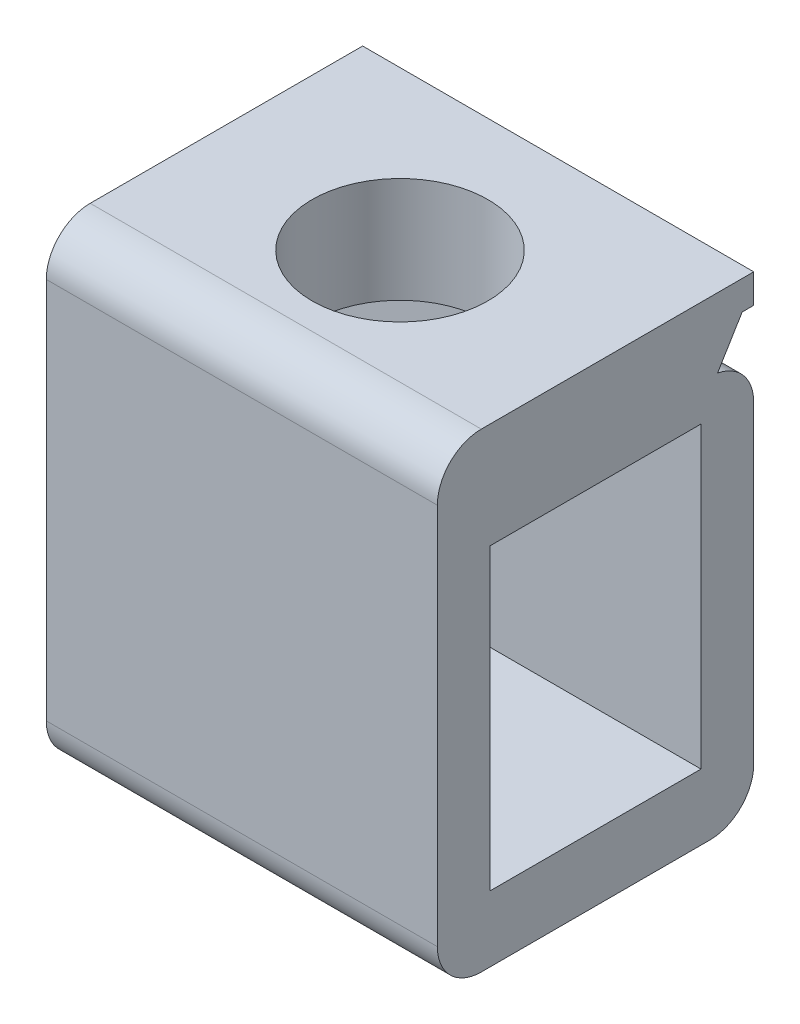
ISO-10303-21;
HEADER;
FILE_DESCRIPTION(('STEP AP214'),'2;1');
FILE_NAME('part.step','',(''),(''),'','','');
FILE_SCHEMA(('AUTOMOTIVE_DESIGN { 1 0 10303 214 1 1 1 1 }'));
ENDSEC;
DATA;
#1=APPLICATION_CONTEXT('core data for automotive mechanical design processes');
#2=APPLICATION_PROTOCOL_DEFINITION('international standard','automotive_design',2000,#1);
#3=PRODUCT_CONTEXT('',#1,'mechanical');
#4=PRODUCT('Part','Part','',(#3));
#5=PRODUCT_RELATED_PRODUCT_CATEGORY('part','',(#4));
#6=PRODUCT_DEFINITION_FORMATION('','',#4);
#7=PRODUCT_DEFINITION_CONTEXT('part definition',#1,'design');
#8=PRODUCT_DEFINITION('design','',#6,#7);
#9=PRODUCT_DEFINITION_SHAPE('','',#8);
#10=(LENGTH_UNIT() NAMED_UNIT(*) SI_UNIT(.MILLI.,.METRE.));
#11=(NAMED_UNIT(*) PLANE_ANGLE_UNIT() SI_UNIT($,.RADIAN.));
#12=(NAMED_UNIT(*) SI_UNIT($,.STERADIAN.) SOLID_ANGLE_UNIT());
#13=UNCERTAINTY_MEASURE_WITH_UNIT(LENGTH_MEASURE(1.E-05),#10,'distance_accuracy_value','');
#14=(GEOMETRIC_REPRESENTATION_CONTEXT(3) GLOBAL_UNCERTAINTY_ASSIGNED_CONTEXT((#13)) GLOBAL_UNIT_ASSIGNED_CONTEXT((#10,
#11,#12)) REPRESENTATION_CONTEXT('',''));
#15=CARTESIAN_POINT('',(0.,0.,0.));
#16=DIRECTION('',(0.,0.,1.));
#17=DIRECTION('',(1.,0.,0.));
#18=AXIS2_PLACEMENT_3D('',#15,#16,#17);
#19=CARTESIAN_POINT('',(-4.45,5.35,-3.6));
#20=DIRECTION('',(0.,0.,-1.));
#21=DIRECTION('',(0.,1.,0.));
#22=AXIS2_PLACEMENT_3D('',#19,#20,#21);
#23=PLANE('',#22);
#24=DIRECTION('',(0.,1.,0.));
#25=VECTOR('',#24,1.);
#26=CARTESIAN_POINT('',(-4.45,5.35,-3.6));
#27=LINE('',#26,#25);
#28=CARTESIAN_POINT('',(-4.45,-4.34999999999999,-3.60000000000001));
#29=VERTEX_POINT('',#28);
#30=CARTESIAN_POINT('',(-4.45,2.78084650987557,-3.6));
#31=VERTEX_POINT('',#30);
#32=EDGE_CURVE('E231',#29,#31,#27,.T.);
#33=ORIENTED_EDGE('',*,*,#32,.T.);
#34=DIRECTION('',(1.,0.,0.));
#35=VECTOR('',#34,1.);
#36=CARTESIAN_POINT('',(4.45,2.78084650987557,-3.6));
#37=LINE('',#36,#35);
#38=CARTESIAN_POINT('',(4.45,2.78084650987557,-3.6));
#39=VERTEX_POINT('',#38);
#40=EDGE_CURVE('E243',#31,#39,#37,.T.);
#41=ORIENTED_EDGE('',*,*,#40,.T.);
#42=DIRECTION('',(0.,1.,0.));
#43=VECTOR('',#42,1.);
#44=CARTESIAN_POINT('',(4.45,5.35,-3.6));
#45=LINE('',#44,#43);
#46=CARTESIAN_POINT('',(4.45,-4.34999999999999,-3.60000000000001));
#47=VERTEX_POINT('',#46);
#48=EDGE_CURVE('E200',#47,#39,#45,.T.);
#49=ORIENTED_EDGE('',*,*,#48,.F.);
#50=DIRECTION('',(1.,0.,0.));
#51=VECTOR('',#50,1.);
#52=CARTESIAN_POINT('',(-4.45,-4.34999999999999,-3.60000000000001));
#53=LINE('',#52,#51);
#54=EDGE_CURVE('E239',#47,#29,#53,.F.);
#55=ORIENTED_EDGE('',*,*,#54,.T.);
#56=EDGE_LOOP('',(#33,#41,#49,#55));
#57=FACE_BOUND('',#56,.T.);
#58=ADVANCED_FACE('F37',(#57),#23,.T.);
#59=CARTESIAN_POINT('',(-4.45,5.35,3.6));
#60=DIRECTION('',(0.,0.,1.));
#61=DIRECTION('',(0.,-1.,0.));
#62=AXIS2_PLACEMENT_3D('',#59,#60,#61);
#63=PLANE('',#62);
#64=DIRECTION('',(0.,-1.,0.));
#65=VECTOR('',#64,1.);
#66=CARTESIAN_POINT('',(-4.45,5.35,3.6));
#67=LINE('',#66,#65);
#68=CARTESIAN_POINT('',(-4.45,4.35,3.6));
#69=VERTEX_POINT('',#68);
#70=CARTESIAN_POINT('',(-4.45,-4.35,3.6));
#71=VERTEX_POINT('',#70);
#72=EDGE_CURVE('E220',#69,#71,#67,.T.);
#73=ORIENTED_EDGE('',*,*,#72,.T.);
#74=DIRECTION('',(1.,0.,0.));
#75=VECTOR('',#74,1.);
#76=CARTESIAN_POINT('',(-4.45,-4.35,3.6));
#77=LINE('',#76,#75);
#78=CARTESIAN_POINT('',(4.45,-4.35,3.6));
#79=VERTEX_POINT('',#78);
#80=EDGE_CURVE('E45',#71,#79,#77,.T.);
#81=ORIENTED_EDGE('',*,*,#80,.T.);
#82=DIRECTION('',(0.,-1.,0.));
#83=VECTOR('',#82,1.);
#84=CARTESIAN_POINT('',(4.45,5.35,3.6));
#85=LINE('',#84,#83);
#86=CARTESIAN_POINT('',(4.45,4.35,3.6));
#87=VERTEX_POINT('',#86);
#88=EDGE_CURVE('E193',#87,#79,#85,.T.);
#89=ORIENTED_EDGE('',*,*,#88,.F.);
#90=DIRECTION('',(1.,0.,0.));
#91=VECTOR('',#90,1.);
#92=CARTESIAN_POINT('',(-4.45,4.35,3.6));
#93=LINE('',#92,#91);
#94=EDGE_CURVE('E264',#87,#69,#93,.F.);
#95=ORIENTED_EDGE('',*,*,#94,.T.);
#96=EDGE_LOOP('',(#73,#81,#89,#95));
#97=FACE_BOUND('',#96,.T.);
#98=ADVANCED_FACE('F269',(#97),#63,.T.);
#99=CARTESIAN_POINT('',(-4.45,5.35,3.6));
#100=DIRECTION('',(0.,1.,0.));
#101=DIRECTION('',(0.,0.,1.));
#102=AXIS2_PLACEMENT_3D('',#99,#100,#101);
#103=PLANE('',#102);
#104=CARTESIAN_POINT('',(0.,5.35,0.));
#105=DIRECTION('',(0.,1.,0.));
#106=DIRECTION('',(0.,0.,1.));
#107=AXIS2_PLACEMENT_3D('',#104,#105,#106);
#108=CIRCLE('',#107,2.);
#109=CARTESIAN_POINT('',(0.,5.35,2.));
#110=VERTEX_POINT('',#109);
#111=EDGE_CURVE('E177',#110,#110,#108,.T.);
#112=ORIENTED_EDGE('',*,*,#111,.F.);
#113=EDGE_LOOP('',(#112));
#114=FACE_BOUND('',#113,.T.);
#115=DIRECTION('',(0.,0.,1.));
#116=VECTOR('',#115,1.);
#117=CARTESIAN_POINT('',(-4.45,5.35,3.6));
#118=LINE('',#117,#116);
#119=CARTESIAN_POINT('',(-4.45,5.35,-3.6));
#120=VERTEX_POINT('',#119);
#121=CARTESIAN_POINT('',(-4.45,5.35,2.6));
#122=VERTEX_POINT('',#121);
#123=EDGE_CURVE('E234',#120,#122,#118,.T.);
#124=ORIENTED_EDGE('',*,*,#123,.T.);
#125=DIRECTION('',(1.,0.,0.));
#126=VECTOR('',#125,1.);
#127=CARTESIAN_POINT('',(-4.45,5.35,2.6));
#128=LINE('',#127,#126);
#129=CARTESIAN_POINT('',(4.45,5.35,2.6));
#130=VERTEX_POINT('',#129);
#131=EDGE_CURVE('E11',#122,#130,#128,.T.);
#132=ORIENTED_EDGE('',*,*,#131,.T.);
#133=DIRECTION('',(0.,0.,1.));
#134=VECTOR('',#133,1.);
#135=CARTESIAN_POINT('',(4.45,5.35,3.6));
#136=LINE('',#135,#134);
#137=CARTESIAN_POINT('',(4.45,5.35,-3.6));
#138=VERTEX_POINT('',#137);
#139=EDGE_CURVE('E202',#138,#130,#136,.T.);
#140=ORIENTED_EDGE('',*,*,#139,.F.);
#141=DIRECTION('',(1.,0.,0.));
#142=VECTOR('',#141,1.);
#143=CARTESIAN_POINT('',(-4.45,5.35,-3.6));
#144=LINE('',#143,#142);
#145=EDGE_CURVE('E236',#120,#138,#144,.T.);
#146=ORIENTED_EDGE('',*,*,#145,.F.);
#147=EDGE_LOOP('',(#124,#132,#140,#146));
#148=FACE_BOUND('',#147,.T.);
#149=ADVANCED_FACE('F277',(#114,#148),#103,.T.);
#150=DIRECTION('',(1.,0.,0.));
#151=VECTOR('',#150,1.);
#152=CARTESIAN_POINT('',(-5.68756058204341,4.68856681788835,-3.6));
#153=LINE('',#152,#151);
#154=CARTESIAN_POINT('',(-4.45,4.68856681788835,-3.6));
#155=VERTEX_POINT('',#154);
#156=CARTESIAN_POINT('',(4.45,4.68856681788835,-3.6));
#157=VERTEX_POINT('',#156);
#158=EDGE_CURVE('E157',#155,#157,#153,.T.);
#159=ORIENTED_EDGE('',*,*,#158,.F.);
#160=EDGE_CURVE('E230',#155,#120,#27,.T.);
#161=ORIENTED_EDGE('',*,*,#160,.T.);
#162=ORIENTED_EDGE('',*,*,#145,.T.);
#163=EDGE_CURVE('E199',#157,#138,#45,.T.);
#164=ORIENTED_EDGE('',*,*,#163,.F.);
#165=EDGE_LOOP('',(#159,#161,#162,#164));
#166=FACE_BOUND('',#165,.T.);
#167=ADVANCED_FACE('F282',(#166),#23,.T.);
#168=CARTESIAN_POINT('',(-4.45,-5.35,3.6));
#169=DIRECTION('',(0.,-1.,0.));
#170=DIRECTION('',(0.,0.,-1.));
#171=AXIS2_PLACEMENT_3D('',#168,#169,#170);
#172=PLANE('',#171);
#173=DIRECTION('',(0.,0.,-1.));
#174=VECTOR('',#173,1.);
#175=CARTESIAN_POINT('',(-4.45,-5.35,3.6));
#176=LINE('',#175,#174);
#177=CARTESIAN_POINT('',(-4.45,-5.35,2.6));
#178=VERTEX_POINT('',#177);
#179=CARTESIAN_POINT('',(-4.45,-5.35,-2.60000000000001));
#180=VERTEX_POINT('',#179);
#181=EDGE_CURVE('E227',#178,#180,#176,.T.);
#182=ORIENTED_EDGE('',*,*,#181,.T.);
#183=DIRECTION('',(1.,0.,0.));
#184=VECTOR('',#183,1.);
#185=CARTESIAN_POINT('',(-4.45,-5.35,-2.60000000000001));
#186=LINE('',#185,#184);
#187=CARTESIAN_POINT('',(4.45,-5.35,-2.60000000000001));
#188=VERTEX_POINT('',#187);
#189=EDGE_CURVE('E261',#180,#188,#186,.T.);
#190=ORIENTED_EDGE('',*,*,#189,.T.);
#191=DIRECTION('',(0.,0.,-1.));
#192=VECTOR('',#191,1.);
#193=CARTESIAN_POINT('',(4.45,-5.35,3.6));
#194=LINE('',#193,#192);
#195=CARTESIAN_POINT('',(4.45,-5.35,2.6));
#196=VERTEX_POINT('',#195);
#197=EDGE_CURVE('E196',#196,#188,#194,.T.);
#198=ORIENTED_EDGE('',*,*,#197,.F.);
#199=DIRECTION('',(1.,0.,0.));
#200=VECTOR('',#199,1.);
#201=CARTESIAN_POINT('',(-4.45,-5.35,2.6));
#202=LINE('',#201,#200);
#203=EDGE_CURVE('E259',#196,#178,#202,.F.);
#204=ORIENTED_EDGE('',*,*,#203,.T.);
#205=EDGE_LOOP('',(#182,#190,#198,#204));
#206=FACE_BOUND('',#205,.T.);
#207=ADVANCED_FACE('F284',(#206),#172,.T.);
#208=CARTESIAN_POINT('',(-4.45,0.,0.));
#209=DIRECTION('',(1.,0.,0.));
#210=DIRECTION('',(0.,0.,-1.));
#211=AXIS2_PLACEMENT_3D('',#208,#209,#210);
#212=PLANE('',#211);
#213=DIRECTION('',(0.,0.,-1.));
#214=VECTOR('',#213,1.);
#215=CARTESIAN_POINT('',(-4.45,-3.85,-2.40000000000002));
#216=LINE('',#215,#214);
#217=CARTESIAN_POINT('',(-4.45,-3.85,2.4));
#218=VERTEX_POINT('',#217);
#219=CARTESIAN_POINT('',(-4.45,-3.85,-2.40000000000002));
#220=VERTEX_POINT('',#219);
#221=EDGE_CURVE('E214',#218,#220,#216,.T.);
#222=ORIENTED_EDGE('',*,*,#221,.T.);
#223=DIRECTION('',(0.,1.,0.));
#224=VECTOR('',#223,1.);
#225=CARTESIAN_POINT('',(-4.45,-3.85,-2.40000000000002));
#226=LINE('',#225,#224);
#227=CARTESIAN_POINT('',(-4.45,2.95,-2.40000000000002));
#228=VERTEX_POINT('',#227);
#229=EDGE_CURVE('E205',#220,#228,#226,.T.);
#230=ORIENTED_EDGE('',*,*,#229,.T.);
#231=DIRECTION('',(0.,0.,1.));
#232=VECTOR('',#231,1.);
#233=CARTESIAN_POINT('',(-4.45,2.95,-2.40000000000002));
#234=LINE('',#233,#232);
#235=CARTESIAN_POINT('',(-4.45,2.95,2.4));
#236=VERTEX_POINT('',#235);
#237=EDGE_CURVE('E208',#228,#236,#234,.T.);
#238=ORIENTED_EDGE('',*,*,#237,.T.);
#239=DIRECTION('',(0.,-1.,0.));
#240=VECTOR('',#239,1.);
#241=CARTESIAN_POINT('',(-4.45,-3.85,2.4));
#242=LINE('',#241,#240);
#243=EDGE_CURVE('E211',#236,#218,#242,.T.);
#244=ORIENTED_EDGE('',*,*,#243,.T.);
#245=EDGE_LOOP('',(#222,#230,#238,#244));
#246=FACE_BOUND('',#245,.T.);
#247=DIRECTION('',(0.,0.854660940645828,-0.519186552728775));
#248=VECTOR('',#247,1.);
#249=CARTESIAN_POINT('',(-4.45,4.68856681788835,-3.33686645723071));
#250=LINE('',#249,#248);
#251=CARTESIAN_POINT('',(-4.45,3.76524232549678,-2.77596840110499));
#252=VERTEX_POINT('',#251);
#253=CARTESIAN_POINT('',(-4.45,4.68856681788835,-3.33686645723071));
#254=VERTEX_POINT('',#253);
#255=EDGE_CURVE('E153',#252,#254,#250,.T.);
#256=ORIENTED_EDGE('',*,*,#255,.F.);
#257=CARTESIAN_POINT('',(-4.45,2.78084650987556,-2.6));
#258=DIRECTION('',(1.,0.,0.));
#259=DIRECTION('',(0.,0.,-1.));
#260=AXIS2_PLACEMENT_3D('',#257,#258,#259);
#261=CIRCLE('',#260,1.);
#262=EDGE_CURVE('E257',#252,#31,#261,.F.);
#263=ORIENTED_EDGE('',*,*,#262,.T.);
#264=ORIENTED_EDGE('',*,*,#32,.F.);
#265=CARTESIAN_POINT('',(-4.45,-4.35,-2.60000000000001));
#266=DIRECTION('',(1.,0.,0.));
#267=DIRECTION('',(0.,0.,-1.));
#268=AXIS2_PLACEMENT_3D('',#265,#266,#267);
#269=CIRCLE('',#268,1.);
#270=EDGE_CURVE('E255',#29,#180,#269,.F.);
#271=ORIENTED_EDGE('',*,*,#270,.T.);
#272=ORIENTED_EDGE('',*,*,#181,.F.);
#273=CARTESIAN_POINT('',(-4.45,-4.35,2.6));
#274=DIRECTION('',(1.,0.,0.));
#275=DIRECTION('',(0.,0.,-1.));
#276=AXIS2_PLACEMENT_3D('',#273,#274,#275);
#277=CIRCLE('',#276,1.);
#278=EDGE_CURVE('E58',#178,#71,#277,.F.);
#279=ORIENTED_EDGE('',*,*,#278,.T.);
#280=ORIENTED_EDGE('',*,*,#72,.F.);
#281=CARTESIAN_POINT('',(-4.45,4.35,2.6));
#282=DIRECTION('',(1.,0.,0.));
#283=DIRECTION('',(0.,0.,-1.));
#284=AXIS2_PLACEMENT_3D('',#281,#282,#283);
#285=CIRCLE('',#284,1.);
#286=EDGE_CURVE('E52',#69,#122,#285,.F.);
#287=ORIENTED_EDGE('',*,*,#286,.T.);
#288=ORIENTED_EDGE('',*,*,#123,.F.);
#289=ORIENTED_EDGE('',*,*,#160,.F.);
#290=DIRECTION('',(0.,0.,-1.));
#291=VECTOR('',#290,1.);
#292=CARTESIAN_POINT('',(-4.45,4.68856681788835,-3.6));
#293=LINE('',#292,#291);
#294=EDGE_CURVE('E175',#254,#155,#293,.T.);
#295=ORIENTED_EDGE('',*,*,#294,.F.);
#296=EDGE_LOOP('',(#256,#263,#264,#271,#272,#279,#280,#287,#288,#289,#295));
#297=FACE_BOUND('',#296,.T.);
#298=ADVANCED_FACE('F280',(#246,#297),#212,.F.);
#299=CARTESIAN_POINT('',(-4.45,-3.85,-2.40000000000002));
#300=DIRECTION('',(0.,0.,-1.));
#301=DIRECTION('',(0.,1.,0.));
#302=AXIS2_PLACEMENT_3D('',#299,#300,#301);
#303=PLANE('',#302);
#304=DIRECTION('',(1.,0.,0.));
#305=VECTOR('',#304,1.);
#306=CARTESIAN_POINT('',(-4.45,-3.85,-2.40000000000002));
#307=LINE('',#306,#305);
#308=CARTESIAN_POINT('',(4.45,-3.85,-2.40000000000002));
#309=VERTEX_POINT('',#308);
#310=EDGE_CURVE('E218',#220,#309,#307,.T.);
#311=ORIENTED_EDGE('',*,*,#310,.T.);
#312=DIRECTION('',(0.,1.,0.));
#313=VECTOR('',#312,1.);
#314=CARTESIAN_POINT('',(4.45,-3.85,-2.40000000000002));
#315=LINE('',#314,#313);
#316=CARTESIAN_POINT('',(4.45,2.95,-2.40000000000002));
#317=VERTEX_POINT('',#316);
#318=EDGE_CURVE('E181',#309,#317,#315,.T.);
#319=ORIENTED_EDGE('',*,*,#318,.T.);
#320=DIRECTION('',(1.,0.,0.));
#321=VECTOR('',#320,1.);
#322=CARTESIAN_POINT('',(-4.45,2.95,-2.40000000000002));
#323=LINE('',#322,#321);
#324=EDGE_CURVE('E217',#228,#317,#323,.T.);
#325=ORIENTED_EDGE('',*,*,#324,.F.);
#326=ORIENTED_EDGE('',*,*,#229,.F.);
#327=EDGE_LOOP('',(#311,#319,#325,#326));
#328=FACE_BOUND('',#327,.T.);
#329=ADVANCED_FACE('F374',(#328),#303,.F.);
#330=CARTESIAN_POINT('',(-4.45,-3.85,-2.40000000000002));
#331=DIRECTION('',(0.,-1.,0.));
#332=DIRECTION('',(0.,0.,-1.));
#333=AXIS2_PLACEMENT_3D('',#330,#331,#332);
#334=PLANE('',#333);
#335=DIRECTION('',(1.,0.,0.));
#336=VECTOR('',#335,1.);
#337=CARTESIAN_POINT('',(-4.45,-3.85,2.4));
#338=LINE('',#337,#336);
#339=CARTESIAN_POINT('',(4.45,-3.85,2.4));
#340=VERTEX_POINT('',#339);
#341=EDGE_CURVE('E221',#218,#340,#338,.T.);
#342=ORIENTED_EDGE('',*,*,#341,.T.);
#343=DIRECTION('',(0.,0.,-1.));
#344=VECTOR('',#343,1.);
#345=CARTESIAN_POINT('',(4.45,-3.85,-2.40000000000002));
#346=LINE('',#345,#344);
#347=EDGE_CURVE('E190',#340,#309,#346,.T.);
#348=ORIENTED_EDGE('',*,*,#347,.T.);
#349=ORIENTED_EDGE('',*,*,#310,.F.);
#350=ORIENTED_EDGE('',*,*,#221,.F.);
#351=EDGE_LOOP('',(#342,#348,#349,#350));
#352=FACE_BOUND('',#351,.T.);
#353=ADVANCED_FACE('F431',(#352),#334,.F.);
#354=CARTESIAN_POINT('',(-4.45,-3.85,2.4));
#355=DIRECTION('',(0.,0.,1.));
#356=DIRECTION('',(1.,0.,0.));
#357=AXIS2_PLACEMENT_3D('',#354,#355,#356);
#358=PLANE('',#357);
#359=DIRECTION('',(1.,0.,0.));
#360=VECTOR('',#359,1.);
#361=CARTESIAN_POINT('',(-4.45,2.95,2.4));
#362=LINE('',#361,#360);
#363=CARTESIAN_POINT('',(4.45,2.95,2.4));
#364=VERTEX_POINT('',#363);
#365=EDGE_CURVE('E223',#236,#364,#362,.T.);
#366=ORIENTED_EDGE('',*,*,#365,.T.);
#367=DIRECTION('',(0.,-1.,0.));
#368=VECTOR('',#367,1.);
#369=CARTESIAN_POINT('',(4.45,-3.85,2.4));
#370=LINE('',#369,#368);
#371=EDGE_CURVE('E187',#364,#340,#370,.T.);
#372=ORIENTED_EDGE('',*,*,#371,.T.);
#373=ORIENTED_EDGE('',*,*,#341,.F.);
#374=ORIENTED_EDGE('',*,*,#243,.F.);
#375=EDGE_LOOP('',(#366,#372,#373,#374));
#376=FACE_BOUND('',#375,.T.);
#377=ADVANCED_FACE('F421',(#376),#358,.F.);
#378=CARTESIAN_POINT('',(-4.45,2.95,-2.40000000000002));
#379=DIRECTION('',(0.,1.,0.));
#380=DIRECTION('',(0.,0.,1.));
#381=AXIS2_PLACEMENT_3D('',#378,#379,#380);
#382=PLANE('',#381);
#383=CARTESIAN_POINT('',(0.,2.95,0.));
#384=DIRECTION('',(0.,1.,0.));
#385=DIRECTION('',(0.,0.,1.));
#386=AXIS2_PLACEMENT_3D('',#383,#384,#385);
#387=CIRCLE('',#386,2.);
#388=CARTESIAN_POINT('',(0.,2.95,2.));
#389=VERTEX_POINT('',#388);
#390=EDGE_CURVE('E180',#389,#389,#387,.T.);
#391=ORIENTED_EDGE('',*,*,#390,.T.);
#392=EDGE_LOOP('',(#391));
#393=FACE_BOUND('',#392,.T.);
#394=ORIENTED_EDGE('',*,*,#324,.T.);
#395=DIRECTION('',(0.,0.,1.));
#396=VECTOR('',#395,1.);
#397=CARTESIAN_POINT('',(4.45,2.95,-2.40000000000002));
#398=LINE('',#397,#396);
#399=EDGE_CURVE('E184',#317,#364,#398,.T.);
#400=ORIENTED_EDGE('',*,*,#399,.T.);
#401=ORIENTED_EDGE('',*,*,#365,.F.);
#402=ORIENTED_EDGE('',*,*,#237,.F.);
#403=EDGE_LOOP('',(#394,#400,#401,#402));
#404=FACE_BOUND('',#403,.T.);
#405=ADVANCED_FACE('F362',(#393,#404),#382,.F.);
#406=CARTESIAN_POINT('',(4.45,0.,0.));
#407=DIRECTION('',(1.,0.,0.));
#408=DIRECTION('',(0.,0.,-1.));
#409=AXIS2_PLACEMENT_3D('',#406,#407,#408);
#410=PLANE('',#409);
#411=ORIENTED_EDGE('',*,*,#48,.T.);
#412=CARTESIAN_POINT('',(4.45,2.78084650987556,-2.6));
#413=DIRECTION('',(1.,0.,0.));
#414=DIRECTION('',(0.,0.,-1.));
#415=AXIS2_PLACEMENT_3D('',#412,#413,#414);
#416=CIRCLE('',#415,1.);
#417=CARTESIAN_POINT('',(4.45,3.76524232549678,-2.77596840110499));
#418=VERTEX_POINT('',#417);
#419=EDGE_CURVE('E169',#39,#418,#416,.T.);
#420=ORIENTED_EDGE('',*,*,#419,.T.);
#421=DIRECTION('',(0.,-0.854660940645828,0.519186552728775));
#422=VECTOR('',#421,1.);
#423=CARTESIAN_POINT('',(4.45,4.68856681788835,-3.33686645723071));
#424=LINE('',#423,#422);
#425=CARTESIAN_POINT('',(4.45,4.68856681788835,-3.33686645723071));
#426=VERTEX_POINT('',#425);
#427=EDGE_CURVE('E150',#426,#418,#424,.T.);
#428=ORIENTED_EDGE('',*,*,#427,.F.);
#429=DIRECTION('',(0.,0.,1.));
#430=VECTOR('',#429,1.);
#431=CARTESIAN_POINT('',(4.45,4.68856681788835,-3.6));
#432=LINE('',#431,#430);
#433=EDGE_CURVE('E160',#157,#426,#432,.T.);
#434=ORIENTED_EDGE('',*,*,#433,.F.);
#435=ORIENTED_EDGE('',*,*,#163,.T.);
#436=ORIENTED_EDGE('',*,*,#139,.T.);
#437=CARTESIAN_POINT('',(4.45,4.35,2.6));
#438=DIRECTION('',(1.,0.,0.));
#439=DIRECTION('',(0.,0.,-1.));
#440=AXIS2_PLACEMENT_3D('',#437,#438,#439);
#441=CIRCLE('',#440,1.);
#442=EDGE_CURVE('E246',#130,#87,#441,.T.);
#443=ORIENTED_EDGE('',*,*,#442,.T.);
#444=ORIENTED_EDGE('',*,*,#88,.T.);
#445=CARTESIAN_POINT('',(4.45,-4.35,2.6));
#446=DIRECTION('',(1.,0.,0.));
#447=DIRECTION('',(0.,0.,-1.));
#448=AXIS2_PLACEMENT_3D('',#445,#446,#447);
#449=CIRCLE('',#448,1.);
#450=EDGE_CURVE('E248',#79,#196,#449,.T.);
#451=ORIENTED_EDGE('',*,*,#450,.T.);
#452=ORIENTED_EDGE('',*,*,#197,.T.);
#453=CARTESIAN_POINT('',(4.45,-4.35,-2.60000000000001));
#454=DIRECTION('',(1.,0.,0.));
#455=DIRECTION('',(0.,0.,-1.));
#456=AXIS2_PLACEMENT_3D('',#453,#454,#455);
#457=CIRCLE('',#456,1.);
#458=EDGE_CURVE('E250',#188,#47,#457,.T.);
#459=ORIENTED_EDGE('',*,*,#458,.T.);
#460=EDGE_LOOP('',(#411,#420,#428,#434,#435,#436,#443,#444,#451,#452,#459));
#461=FACE_BOUND('',#460,.T.);
#462=ORIENTED_EDGE('',*,*,#399,.F.);
#463=ORIENTED_EDGE('',*,*,#318,.F.);
#464=ORIENTED_EDGE('',*,*,#347,.F.);
#465=ORIENTED_EDGE('',*,*,#371,.F.);
#466=EDGE_LOOP('',(#462,#463,#464,#465));
#467=FACE_BOUND('',#466,.T.);
#468=ADVANCED_FACE('F167',(#461,#467),#410,.T.);
#469=CARTESIAN_POINT('',(0.,0.350000000000004,0.));
#470=DIRECTION('',(0.,1.,0.));
#471=DIRECTION('',(0.,0.,1.));
#472=AXIS2_PLACEMENT_3D('',#469,#470,#471);
#473=CYLINDRICAL_SURFACE('',#472,2.);
#474=ORIENTED_EDGE('',*,*,#111,.T.);
#475=EDGE_LOOP('',(#474));
#476=FACE_BOUND('',#475,.T.);
#477=ORIENTED_EDGE('',*,*,#390,.F.);
#478=EDGE_LOOP('',(#477));
#479=FACE_BOUND('',#478,.T.);
#480=ADVANCED_FACE('F351',(#476,#479),#473,.F.);
#481=CARTESIAN_POINT('',(-5.68756058204341,4.68856681788835,-3.33686645723071));
#482=DIRECTION('',(0.,0.519186552728775,0.854660940645828));
#483=DIRECTION('',(0.,-0.854660940645828,0.519186552728775));
#484=AXIS2_PLACEMENT_3D('',#481,#482,#483);
#485=PLANE('',#484);
#486=ORIENTED_EDGE('',*,*,#255,.T.);
#487=DIRECTION('',(1.,0.,0.));
#488=VECTOR('',#487,1.);
#489=CARTESIAN_POINT('',(-5.68756058204341,4.68856681788835,-3.33686645723071));
#490=LINE('',#489,#488);
#491=EDGE_CURVE('E146',#254,#426,#490,.T.);
#492=ORIENTED_EDGE('',*,*,#491,.T.);
#493=ORIENTED_EDGE('',*,*,#427,.T.);
#494=DIRECTION('',(1.,0.,0.));
#495=VECTOR('',#494,1.);
#496=CARTESIAN_POINT('',(-5.68756058204341,3.76524232549678,-2.77596840110499));
#497=LINE('',#496,#495);
#498=EDGE_CURVE('E156',#252,#418,#497,.T.);
#499=ORIENTED_EDGE('',*,*,#498,.F.);
#500=EDGE_LOOP('',(#486,#492,#493,#499));
#501=FACE_BOUND('',#500,.T.);
#502=ADVANCED_FACE('F148',(#501),#485,.F.);
#503=CARTESIAN_POINT('',(-5.68756058204341,4.68856681788835,-3.6));
#504=DIRECTION('',(0.,1.,0.));
#505=DIRECTION('',(0.,0.,1.));
#506=AXIS2_PLACEMENT_3D('',#503,#504,#505);
#507=PLANE('',#506);
#508=ORIENTED_EDGE('',*,*,#294,.T.);
#509=ORIENTED_EDGE('',*,*,#158,.T.);
#510=ORIENTED_EDGE('',*,*,#433,.T.);
#511=ORIENTED_EDGE('',*,*,#491,.F.);
#512=EDGE_LOOP('',(#508,#509,#510,#511));
#513=FACE_BOUND('',#512,.T.);
#514=ADVANCED_FACE('F161',(#513),#507,.F.);
#515=CARTESIAN_POINT('',(-5.68756058204341,2.78084650987556,-2.6));
#516=DIRECTION('',(-1.,0.,0.));
#517=DIRECTION('',(0.,0.,1.));
#518=AXIS2_PLACEMENT_3D('',#515,#516,#517);
#519=CYLINDRICAL_SURFACE('',#518,1.);
#520=ORIENTED_EDGE('',*,*,#262,.F.);
#521=ORIENTED_EDGE('',*,*,#498,.T.);
#522=ORIENTED_EDGE('',*,*,#419,.F.);
#523=ORIENTED_EDGE('',*,*,#40,.F.);
#524=EDGE_LOOP('',(#520,#521,#522,#523));
#525=FACE_BOUND('',#524,.T.);
#526=ADVANCED_FACE('F307',(#525),#519,.T.);
#527=CARTESIAN_POINT('',(-4.45,-4.35,-2.60000000000001));
#528=DIRECTION('',(1.,0.,0.));
#529=DIRECTION('',(0.,0.,-1.));
#530=AXIS2_PLACEMENT_3D('',#527,#528,#529);
#531=CYLINDRICAL_SURFACE('',#530,1.);
#532=ORIENTED_EDGE('',*,*,#270,.F.);
#533=ORIENTED_EDGE('',*,*,#54,.F.);
#534=ORIENTED_EDGE('',*,*,#458,.F.);
#535=ORIENTED_EDGE('',*,*,#189,.F.);
#536=EDGE_LOOP('',(#532,#533,#534,#535));
#537=FACE_BOUND('',#536,.T.);
#538=ADVANCED_FACE('F309',(#537),#531,.T.);
#539=CARTESIAN_POINT('',(-4.45,-4.35,2.6));
#540=DIRECTION('',(1.,0.,0.));
#541=DIRECTION('',(0.,0.,-1.));
#542=AXIS2_PLACEMENT_3D('',#539,#540,#541);
#543=CYLINDRICAL_SURFACE('',#542,1.);
#544=ORIENTED_EDGE('',*,*,#278,.F.);
#545=ORIENTED_EDGE('',*,*,#203,.F.);
#546=ORIENTED_EDGE('',*,*,#450,.F.);
#547=ORIENTED_EDGE('',*,*,#80,.F.);
#548=EDGE_LOOP('',(#544,#545,#546,#547));
#549=FACE_BOUND('',#548,.T.);
#550=ADVANCED_FACE('F315',(#549),#543,.T.);
#551=CARTESIAN_POINT('',(-4.45,4.35,2.6));
#552=DIRECTION('',(1.,0.,0.));
#553=DIRECTION('',(0.,0.,-1.));
#554=AXIS2_PLACEMENT_3D('',#551,#552,#553);
#555=CYLINDRICAL_SURFACE('',#554,1.);
#556=ORIENTED_EDGE('',*,*,#286,.F.);
#557=ORIENTED_EDGE('',*,*,#94,.F.);
#558=ORIENTED_EDGE('',*,*,#442,.F.);
#559=ORIENTED_EDGE('',*,*,#131,.F.);
#560=EDGE_LOOP('',(#556,#557,#558,#559));
#561=FACE_BOUND('',#560,.T.);
#562=ADVANCED_FACE('F39',(#561),#555,.T.);
#563=CLOSED_SHELL('',(#58,#98,#149,#167,#207,#298,#329,#353,#377,#405,#468,#480,#502,#514,#526,
#538,#550,#562));
#564=MANIFOLD_SOLID_BREP('B2',#563);
#565=ADVANCED_BREP_SHAPE_REPRESENTATION('',(#18,#564),#14);
#566=SHAPE_DEFINITION_REPRESENTATION(#9,#565);
ENDSEC;
END-ISO-10303-21;
